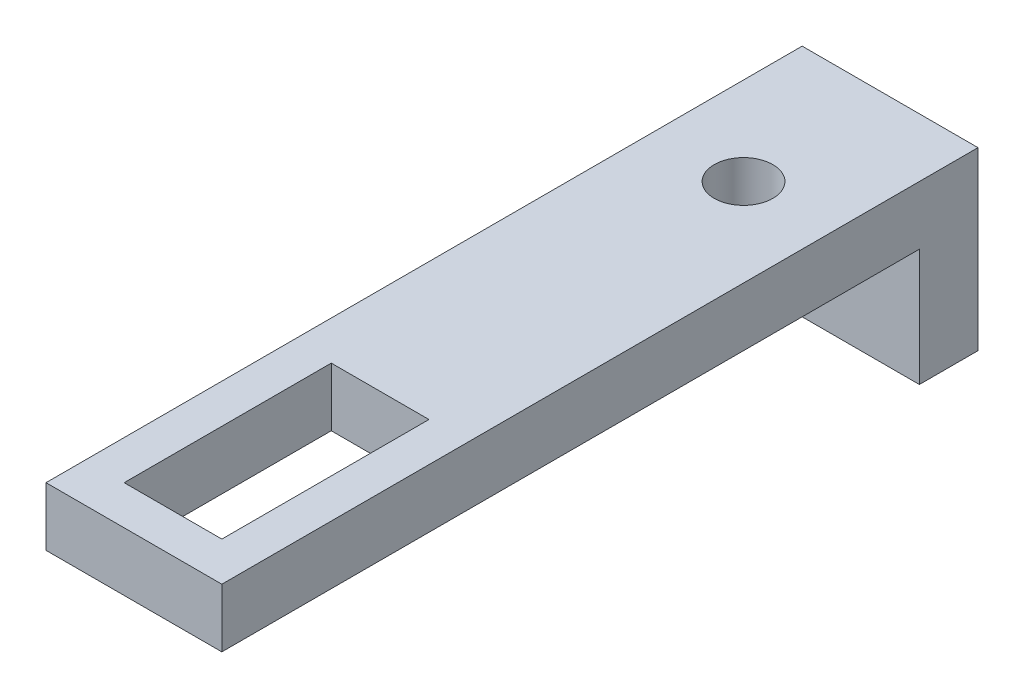
ISO-10303-21;
HEADER;
FILE_DESCRIPTION(('STEP AP214'),'2;1');
FILE_NAME('part.step','',(''),(''),'','','');
FILE_SCHEMA(('AUTOMOTIVE_DESIGN { 1 0 10303 214 1 1 1 1 }'));
ENDSEC;
DATA;
#1=APPLICATION_CONTEXT('core data for automotive mechanical design processes');
#2=APPLICATION_PROTOCOL_DEFINITION('international standard','automotive_design',2000,#1);
#3=PRODUCT_CONTEXT('',#1,'mechanical');
#4=PRODUCT('Part','Part','',(#3));
#5=PRODUCT_RELATED_PRODUCT_CATEGORY('part','',(#4));
#6=PRODUCT_DEFINITION_FORMATION('','',#4);
#7=PRODUCT_DEFINITION_CONTEXT('part definition',#1,'design');
#8=PRODUCT_DEFINITION('design','',#6,#7);
#9=PRODUCT_DEFINITION_SHAPE('','',#8);
#10=(LENGTH_UNIT() NAMED_UNIT(*) SI_UNIT(.MILLI.,.METRE.));
#11=(NAMED_UNIT(*) PLANE_ANGLE_UNIT() SI_UNIT($,.RADIAN.));
#12=(NAMED_UNIT(*) SI_UNIT($,.STERADIAN.) SOLID_ANGLE_UNIT());
#13=UNCERTAINTY_MEASURE_WITH_UNIT(LENGTH_MEASURE(1.E-05),#10,'distance_accuracy_value','');
#14=(GEOMETRIC_REPRESENTATION_CONTEXT(3) GLOBAL_UNCERTAINTY_ASSIGNED_CONTEXT((#13)) GLOBAL_UNIT_ASSIGNED_CONTEXT((#10,
#11,#12)) REPRESENTATION_CONTEXT('',''));
#15=CARTESIAN_POINT('',(0.,0.,0.));
#16=DIRECTION('',(0.,0.,1.));
#17=DIRECTION('',(1.,0.,0.));
#18=AXIS2_PLACEMENT_3D('',#15,#16,#17);
#19=CARTESIAN_POINT('',(0.,3.,0.));
#20=DIRECTION('',(0.,-1.,0.));
#21=DIRECTION('',(0.,0.,-1.));
#22=AXIS2_PLACEMENT_3D('',#19,#20,#21);
#23=PLANE('',#22);
#24=CARTESIAN_POINT('',(-4.5,3.,4.5));
#25=DIRECTION('',(0.,1.,0.));
#26=DIRECTION('',(0.,0.,1.));
#27=AXIS2_PLACEMENT_3D('',#24,#25,#26);
#28=CIRCLE('',#27,1.5);
#29=CARTESIAN_POINT('',(-4.5,3.,6.));
#30=VERTEX_POINT('',#29);
#31=EDGE_CURVE('E202',#30,#30,#28,.T.);
#32=ORIENTED_EDGE('',*,*,#31,.F.);
#33=EDGE_LOOP('',(#32));
#34=FACE_BOUND('',#33,.T.);
#35=DIRECTION('',(0.,0.,-1.));
#36=VECTOR('',#35,1.);
#37=CARTESIAN_POINT('',(0.,3.,0.));
#38=LINE('',#37,#36);
#39=CARTESIAN_POINT('',(0.,3.,35.7));
#40=VERTEX_POINT('',#39);
#41=CARTESIAN_POINT('',(0.,3.,-3.));
#42=VERTEX_POINT('',#41);
#43=EDGE_CURVE('E210',#40,#42,#38,.T.);
#44=ORIENTED_EDGE('',*,*,#43,.T.);
#45=DIRECTION('',(-1.,0.,0.));
#46=VECTOR('',#45,1.);
#47=CARTESIAN_POINT('',(-9.,3.,-3.));
#48=LINE('',#47,#46);
#49=CARTESIAN_POINT('',(-9.,3.,-3.));
#50=VERTEX_POINT('',#49);
#51=EDGE_CURVE('E144',#42,#50,#48,.T.);
#52=ORIENTED_EDGE('',*,*,#51,.T.);
#53=DIRECTION('',(0.,0.,1.));
#54=VECTOR('',#53,1.);
#55=CARTESIAN_POINT('',(-9.,3.,0.));
#56=LINE('',#55,#54);
#57=CARTESIAN_POINT('',(-8.99999999999999,3.,35.7));
#58=VERTEX_POINT('',#57);
#59=EDGE_CURVE('E213',#50,#58,#56,.T.);
#60=ORIENTED_EDGE('',*,*,#59,.T.);
#61=DIRECTION('',(1.,0.,0.));
#62=VECTOR('',#61,1.);
#63=CARTESIAN_POINT('',(0.,3.,35.7));
#64=LINE('',#63,#62);
#65=EDGE_CURVE('E217',#58,#40,#64,.T.);
#66=ORIENTED_EDGE('',*,*,#65,.T.);
#67=EDGE_LOOP('',(#44,#52,#60,#66));
#68=FACE_BOUND('',#67,.T.);
#69=DIRECTION('',(0.,0.,1.));
#70=VECTOR('',#69,1.);
#71=CARTESIAN_POINT('',(-7.,3.,32.7));
#72=LINE('',#71,#70);
#73=CARTESIAN_POINT('',(-7.,3.,23.1));
#74=VERTEX_POINT('',#73);
#75=CARTESIAN_POINT('',(-7.,3.,33.7));
#76=VERTEX_POINT('',#75);
#77=EDGE_CURVE('E163',#74,#76,#72,.T.);
#78=ORIENTED_EDGE('',*,*,#77,.F.);
#79=DIRECTION('',(-1.,0.,0.));
#80=VECTOR('',#79,1.);
#81=CARTESIAN_POINT('',(-7.,3.,23.1));
#82=LINE('',#81,#80);
#83=CARTESIAN_POINT('',(-2.,3.,23.1));
#84=VERTEX_POINT('',#83);
#85=EDGE_CURVE('E173',#84,#74,#82,.T.);
#86=ORIENTED_EDGE('',*,*,#85,.F.);
#87=DIRECTION('',(0.,0.,-1.));
#88=VECTOR('',#87,1.);
#89=CARTESIAN_POINT('',(-2.,3.,33.7));
#90=LINE('',#89,#88);
#91=CARTESIAN_POINT('',(-2.,3.,33.7));
#92=VERTEX_POINT('',#91);
#93=EDGE_CURVE('E170',#92,#84,#90,.T.);
#94=ORIENTED_EDGE('',*,*,#93,.F.);
#95=DIRECTION('',(1.,0.,0.));
#96=VECTOR('',#95,1.);
#97=CARTESIAN_POINT('',(-7.,3.,33.7));
#98=LINE('',#97,#96);
#99=EDGE_CURVE('E166',#76,#92,#98,.T.);
#100=ORIENTED_EDGE('',*,*,#99,.F.);
#101=EDGE_LOOP('',(#78,#86,#94,#100));
#102=FACE_BOUND('',#101,.T.);
#103=ADVANCED_FACE('F39',(#34,#68,#102),#23,.F.);
#104=CARTESIAN_POINT('',(0.,0.,0.));
#105=DIRECTION('',(0.,-1.,0.));
#106=DIRECTION('',(0.,0.,-1.));
#107=AXIS2_PLACEMENT_3D('',#104,#105,#106);
#108=PLANE('',#107);
#109=DIRECTION('',(0.,0.,-1.));
#110=VECTOR('',#109,1.);
#111=CARTESIAN_POINT('',(0.,0.,0.));
#112=LINE('',#111,#110);
#113=CARTESIAN_POINT('',(0.,0.,35.7));
#114=VERTEX_POINT('',#113);
#115=CARTESIAN_POINT('',(0.,0.,0.));
#116=VERTEX_POINT('',#115);
#117=EDGE_CURVE('E206',#114,#116,#112,.T.);
#118=ORIENTED_EDGE('',*,*,#117,.F.);
#119=DIRECTION('',(1.,0.,0.));
#120=VECTOR('',#119,1.);
#121=CARTESIAN_POINT('',(0.,0.,35.7));
#122=LINE('',#121,#120);
#123=CARTESIAN_POINT('',(-8.99999999999999,0.,35.7));
#124=VERTEX_POINT('',#123);
#125=EDGE_CURVE('E214',#124,#114,#122,.T.);
#126=ORIENTED_EDGE('',*,*,#125,.F.);
#127=DIRECTION('',(0.,0.,1.));
#128=VECTOR('',#127,1.);
#129=CARTESIAN_POINT('',(-9.,0.,0.));
#130=LINE('',#129,#128);
#131=CARTESIAN_POINT('',(-9.,0.,0.));
#132=VERTEX_POINT('',#131);
#133=EDGE_CURVE('E225',#132,#124,#130,.T.);
#134=ORIENTED_EDGE('',*,*,#133,.F.);
#135=DIRECTION('',(-1.,0.,0.));
#136=VECTOR('',#135,1.);
#137=CARTESIAN_POINT('',(0.,0.,0.));
#138=LINE('',#137,#136);
#139=EDGE_CURVE('E122',#116,#132,#138,.T.);
#140=ORIENTED_EDGE('',*,*,#139,.F.);
#141=EDGE_LOOP('',(#118,#126,#134,#140));
#142=FACE_BOUND('',#141,.T.);
#143=CARTESIAN_POINT('',(-4.5,0.,4.5));
#144=DIRECTION('',(0.,1.,0.));
#145=DIRECTION('',(0.,0.,1.));
#146=AXIS2_PLACEMENT_3D('',#143,#144,#145);
#147=CIRCLE('',#146,1.5);
#148=CARTESIAN_POINT('',(-4.5,0.,6.));
#149=VERTEX_POINT('',#148);
#150=EDGE_CURVE('E201',#149,#149,#147,.T.);
#151=ORIENTED_EDGE('',*,*,#150,.T.);
#152=EDGE_LOOP('',(#151));
#153=FACE_BOUND('',#152,.T.);
#154=DIRECTION('',(-1.,0.,0.));
#155=VECTOR('',#154,1.);
#156=CARTESIAN_POINT('',(-7.,0.,23.1));
#157=LINE('',#156,#155);
#158=CARTESIAN_POINT('',(-2.,0.,23.1));
#159=VERTEX_POINT('',#158);
#160=CARTESIAN_POINT('',(-7.,0.,23.1));
#161=VERTEX_POINT('',#160);
#162=EDGE_CURVE('E167',#159,#161,#157,.T.);
#163=ORIENTED_EDGE('',*,*,#162,.T.);
#164=DIRECTION('',(0.,0.,1.));
#165=VECTOR('',#164,1.);
#166=CARTESIAN_POINT('',(-7.,0.,32.7));
#167=LINE('',#166,#165);
#168=CARTESIAN_POINT('',(-7.,0.,33.7));
#169=VERTEX_POINT('',#168);
#170=EDGE_CURVE('E156',#161,#169,#167,.T.);
#171=ORIENTED_EDGE('',*,*,#170,.T.);
#172=DIRECTION('',(1.,0.,0.));
#173=VECTOR('',#172,1.);
#174=CARTESIAN_POINT('',(-7.,0.,33.7));
#175=LINE('',#174,#173);
#176=CARTESIAN_POINT('',(-2.,0.,33.7));
#177=VERTEX_POINT('',#176);
#178=EDGE_CURVE('E179',#169,#177,#175,.T.);
#179=ORIENTED_EDGE('',*,*,#178,.T.);
#180=DIRECTION('',(0.,0.,-1.));
#181=VECTOR('',#180,1.);
#182=CARTESIAN_POINT('',(-2.,0.,32.7));
#183=LINE('',#182,#181);
#184=EDGE_CURVE('E183',#177,#159,#183,.T.);
#185=ORIENTED_EDGE('',*,*,#184,.T.);
#186=EDGE_LOOP('',(#163,#171,#179,#185));
#187=FACE_BOUND('',#186,.T.);
#188=ADVANCED_FACE('F239',(#142,#153,#187),#108,.T.);
#189=CARTESIAN_POINT('',(0.,3.,0.));
#190=DIRECTION('',(-1.,0.,0.));
#191=DIRECTION('',(0.,0.,1.));
#192=AXIS2_PLACEMENT_3D('',#189,#190,#191);
#193=PLANE('',#192);
#194=ORIENTED_EDGE('',*,*,#117,.T.);
#195=DIRECTION('',(0.,1.,0.));
#196=VECTOR('',#195,1.);
#197=CARTESIAN_POINT('',(0.,-6.,0.));
#198=LINE('',#197,#196);
#199=CARTESIAN_POINT('',(0.,-6.,0.));
#200=VERTEX_POINT('',#199);
#201=EDGE_CURVE('E126',#200,#116,#198,.T.);
#202=ORIENTED_EDGE('',*,*,#201,.F.);
#203=DIRECTION('',(0.,0.,-1.));
#204=VECTOR('',#203,1.);
#205=CARTESIAN_POINT('',(0.,-6.,0.));
#206=LINE('',#205,#204);
#207=CARTESIAN_POINT('',(0.,-6.,-3.));
#208=VERTEX_POINT('',#207);
#209=EDGE_CURVE('E137',#200,#208,#206,.T.);
#210=ORIENTED_EDGE('',*,*,#209,.T.);
#211=DIRECTION('',(0.,1.,0.));
#212=VECTOR('',#211,1.);
#213=CARTESIAN_POINT('',(0.,-6.,-3.));
#214=LINE('',#213,#212);
#215=EDGE_CURVE('E157',#208,#42,#214,.T.);
#216=ORIENTED_EDGE('',*,*,#215,.T.);
#217=ORIENTED_EDGE('',*,*,#43,.F.);
#218=DIRECTION('',(0.,-1.,0.));
#219=VECTOR('',#218,1.);
#220=CARTESIAN_POINT('',(0.,3.,35.7));
#221=LINE('',#220,#219);
#222=EDGE_CURVE('E48',#40,#114,#221,.T.);
#223=ORIENTED_EDGE('',*,*,#222,.T.);
#224=EDGE_LOOP('',(#194,#202,#210,#216,#217,#223));
#225=FACE_BOUND('',#224,.T.);
#226=ADVANCED_FACE('F41',(#225),#193,.F.);
#227=CARTESIAN_POINT('',(-9.,3.,0.));
#228=DIRECTION('',(1.,0.,0.));
#229=DIRECTION('',(0.,0.,-1.));
#230=AXIS2_PLACEMENT_3D('',#227,#228,#229);
#231=PLANE('',#230);
#232=ORIENTED_EDGE('',*,*,#133,.T.);
#233=DIRECTION('',(0.,-1.,0.));
#234=VECTOR('',#233,1.);
#235=CARTESIAN_POINT('',(-8.99999999999999,3.,35.7));
#236=LINE('',#235,#234);
#237=EDGE_CURVE('E11',#58,#124,#236,.T.);
#238=ORIENTED_EDGE('',*,*,#237,.F.);
#239=ORIENTED_EDGE('',*,*,#59,.F.);
#240=DIRECTION('',(0.,1.,0.));
#241=VECTOR('',#240,1.);
#242=CARTESIAN_POINT('',(-9.,-6.,-3.));
#243=LINE('',#242,#241);
#244=CARTESIAN_POINT('',(-9.,-6.,-3.));
#245=VERTEX_POINT('',#244);
#246=EDGE_CURVE('E142',#245,#50,#243,.T.);
#247=ORIENTED_EDGE('',*,*,#246,.F.);
#248=DIRECTION('',(0.,0.,1.));
#249=VECTOR('',#248,1.);
#250=CARTESIAN_POINT('',(-9.,-6.,0.));
#251=LINE('',#250,#249);
#252=CARTESIAN_POINT('',(-9.,-6.,0.));
#253=VERTEX_POINT('',#252);
#254=EDGE_CURVE('E134',#245,#253,#251,.T.);
#255=ORIENTED_EDGE('',*,*,#254,.T.);
#256=DIRECTION('',(0.,1.,0.));
#257=VECTOR('',#256,1.);
#258=CARTESIAN_POINT('',(-9.,-6.,0.));
#259=LINE('',#258,#257);
#260=EDGE_CURVE('E117',#253,#132,#259,.T.);
#261=ORIENTED_EDGE('',*,*,#260,.T.);
#262=EDGE_LOOP('',(#232,#238,#239,#247,#255,#261));
#263=FACE_BOUND('',#262,.T.);
#264=ADVANCED_FACE('F140',(#263),#231,.F.);
#265=CARTESIAN_POINT('',(0.,3.,35.7));
#266=DIRECTION('',(0.,0.,-1.));
#267=DIRECTION('',(-1.,0.,0.));
#268=AXIS2_PLACEMENT_3D('',#265,#266,#267);
#269=PLANE('',#268);
#270=ORIENTED_EDGE('',*,*,#125,.T.);
#271=ORIENTED_EDGE('',*,*,#222,.F.);
#272=ORIENTED_EDGE('',*,*,#65,.F.);
#273=ORIENTED_EDGE('',*,*,#237,.T.);
#274=EDGE_LOOP('',(#270,#271,#272,#273));
#275=FACE_BOUND('',#274,.T.);
#276=ADVANCED_FACE('F242',(#275),#269,.F.);
#277=CARTESIAN_POINT('',(-4.5,3.,4.5));
#278=DIRECTION('',(0.,-1.,0.));
#279=DIRECTION('',(0.,0.,-1.));
#280=AXIS2_PLACEMENT_3D('',#277,#278,#279);
#281=CYLINDRICAL_SURFACE('',#280,1.5);
#282=ORIENTED_EDGE('',*,*,#31,.T.);
#283=EDGE_LOOP('',(#282));
#284=FACE_BOUND('',#283,.T.);
#285=ORIENTED_EDGE('',*,*,#150,.F.);
#286=EDGE_LOOP('',(#285));
#287=FACE_BOUND('',#286,.T.);
#288=ADVANCED_FACE('F270',(#284,#287),#281,.F.);
#289=CARTESIAN_POINT('',(-7.,3.,32.7));
#290=DIRECTION('',(1.,0.,0.));
#291=DIRECTION('',(0.,0.,-1.));
#292=AXIS2_PLACEMENT_3D('',#289,#290,#291);
#293=PLANE('',#292);
#294=ORIENTED_EDGE('',*,*,#170,.F.);
#295=DIRECTION('',(0.,-1.,0.));
#296=VECTOR('',#295,1.);
#297=CARTESIAN_POINT('',(-7.,3.,23.1));
#298=LINE('',#297,#296);
#299=EDGE_CURVE('E60',#74,#161,#298,.T.);
#300=ORIENTED_EDGE('',*,*,#299,.F.);
#301=ORIENTED_EDGE('',*,*,#77,.T.);
#302=DIRECTION('',(0.,-1.,0.));
#303=VECTOR('',#302,1.);
#304=CARTESIAN_POINT('',(-7.,3.,33.7));
#305=LINE('',#304,#303);
#306=EDGE_CURVE('E198',#76,#169,#305,.T.);
#307=ORIENTED_EDGE('',*,*,#306,.T.);
#308=EDGE_LOOP('',(#294,#300,#301,#307));
#309=FACE_BOUND('',#308,.T.);
#310=ADVANCED_FACE('F324',(#309),#293,.T.);
#311=CARTESIAN_POINT('',(-7.,3.,33.7));
#312=DIRECTION('',(0.,0.,-1.));
#313=DIRECTION('',(-1.,0.,0.));
#314=AXIS2_PLACEMENT_3D('',#311,#312,#313);
#315=PLANE('',#314);
#316=ORIENTED_EDGE('',*,*,#178,.F.);
#317=ORIENTED_EDGE('',*,*,#306,.F.);
#318=ORIENTED_EDGE('',*,*,#99,.T.);
#319=DIRECTION('',(0.,-1.,0.));
#320=VECTOR('',#319,1.);
#321=CARTESIAN_POINT('',(-2.,3.,33.7));
#322=LINE('',#321,#320);
#323=EDGE_CURVE('E194',#92,#177,#322,.T.);
#324=ORIENTED_EDGE('',*,*,#323,.T.);
#325=EDGE_LOOP('',(#316,#317,#318,#324));
#326=FACE_BOUND('',#325,.T.);
#327=ADVANCED_FACE('F332',(#326),#315,.T.);
#328=CARTESIAN_POINT('',(-2.,3.,32.7));
#329=DIRECTION('',(-1.,0.,0.));
#330=DIRECTION('',(0.,0.,1.));
#331=AXIS2_PLACEMENT_3D('',#328,#329,#330);
#332=PLANE('',#331);
#333=ORIENTED_EDGE('',*,*,#184,.F.);
#334=ORIENTED_EDGE('',*,*,#323,.F.);
#335=ORIENTED_EDGE('',*,*,#93,.T.);
#336=DIRECTION('',(0.,-1.,0.));
#337=VECTOR('',#336,1.);
#338=CARTESIAN_POINT('',(-2.,3.,23.1));
#339=LINE('',#338,#337);
#340=EDGE_CURVE('E55',#84,#159,#339,.T.);
#341=ORIENTED_EDGE('',*,*,#340,.T.);
#342=EDGE_LOOP('',(#333,#334,#335,#341));
#343=FACE_BOUND('',#342,.T.);
#344=ADVANCED_FACE('F257',(#343),#332,.T.);
#345=CARTESIAN_POINT('',(-7.,3.,23.1));
#346=DIRECTION('',(0.,0.,1.));
#347=DIRECTION('',(1.,0.,0.));
#348=AXIS2_PLACEMENT_3D('',#345,#346,#347);
#349=PLANE('',#348);
#350=ORIENTED_EDGE('',*,*,#162,.F.);
#351=ORIENTED_EDGE('',*,*,#340,.F.);
#352=ORIENTED_EDGE('',*,*,#85,.T.);
#353=ORIENTED_EDGE('',*,*,#299,.T.);
#354=EDGE_LOOP('',(#350,#351,#352,#353));
#355=FACE_BOUND('',#354,.T.);
#356=ADVANCED_FACE('F249',(#355),#349,.T.);
#357=CARTESIAN_POINT('',(-9.,-6.,-3.));
#358=DIRECTION('',(0.,0.,-1.));
#359=DIRECTION('',(-1.,0.,0.));
#360=AXIS2_PLACEMENT_3D('',#357,#358,#359);
#361=PLANE('',#360);
#362=ORIENTED_EDGE('',*,*,#51,.F.);
#363=ORIENTED_EDGE('',*,*,#215,.F.);
#364=DIRECTION('',(-1.,0.,0.));
#365=VECTOR('',#364,1.);
#366=CARTESIAN_POINT('',(-9.,-6.,-3.));
#367=LINE('',#366,#365);
#368=EDGE_CURVE('E127',#208,#245,#367,.T.);
#369=ORIENTED_EDGE('',*,*,#368,.T.);
#370=ORIENTED_EDGE('',*,*,#246,.T.);
#371=EDGE_LOOP('',(#362,#363,#369,#370));
#372=FACE_BOUND('',#371,.T.);
#373=ADVANCED_FACE('F247',(#372),#361,.T.);
#374=CARTESIAN_POINT('',(-9.,-6.,0.));
#375=DIRECTION('',(0.,0.,1.));
#376=DIRECTION('',(1.,0.,0.));
#377=AXIS2_PLACEMENT_3D('',#374,#375,#376);
#378=PLANE('',#377);
#379=ORIENTED_EDGE('',*,*,#201,.T.);
#380=ORIENTED_EDGE('',*,*,#139,.T.);
#381=ORIENTED_EDGE('',*,*,#260,.F.);
#382=DIRECTION('',(1.,0.,0.));
#383=VECTOR('',#382,1.);
#384=CARTESIAN_POINT('',(-9.,-6.,0.));
#385=LINE('',#384,#383);
#386=EDGE_CURVE('E121',#253,#200,#385,.T.);
#387=ORIENTED_EDGE('',*,*,#386,.T.);
#388=EDGE_LOOP('',(#379,#380,#381,#387));
#389=FACE_BOUND('',#388,.T.);
#390=ADVANCED_FACE('F120',(#389),#378,.T.);
#391=CARTESIAN_POINT('',(0.,-6.,0.));
#392=DIRECTION('',(0.,-1.,0.));
#393=DIRECTION('',(0.,0.,-1.));
#394=AXIS2_PLACEMENT_3D('',#391,#392,#393);
#395=PLANE('',#394);
#396=ORIENTED_EDGE('',*,*,#254,.F.);
#397=ORIENTED_EDGE('',*,*,#368,.F.);
#398=ORIENTED_EDGE('',*,*,#209,.F.);
#399=ORIENTED_EDGE('',*,*,#386,.F.);
#400=EDGE_LOOP('',(#396,#397,#398,#399));
#401=FACE_BOUND('',#400,.T.);
#402=ADVANCED_FACE('F132',(#401),#395,.T.);
#403=CLOSED_SHELL('',(#103,#188,#226,#264,#276,#288,#310,#327,#344,#356,#373,#390,#402));
#404=MANIFOLD_SOLID_BREP('B2',#403);
#405=ADVANCED_BREP_SHAPE_REPRESENTATION('',(#18,#404),#14);
#406=SHAPE_DEFINITION_REPRESENTATION(#9,#405);
ENDSEC;
END-ISO-10303-21;
